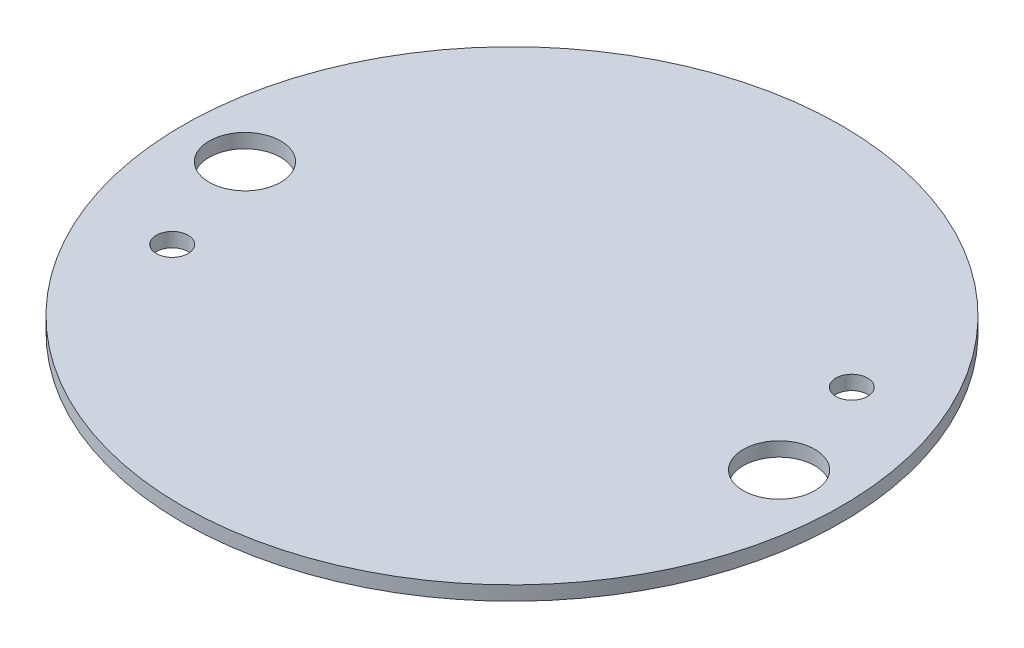
ISO-10303-21;
HEADER;
FILE_DESCRIPTION(('STEP AP214'),'2;1');
FILE_NAME('part.step','',(''),(''),'','','');
FILE_SCHEMA(('AUTOMOTIVE_DESIGN { 1 0 10303 214 1 1 1 1 }'));
ENDSEC;
DATA;
#1=APPLICATION_CONTEXT('core data for automotive mechanical design processes');
#2=APPLICATION_PROTOCOL_DEFINITION('international standard','automotive_design',2000,#1);
#3=PRODUCT_CONTEXT('',#1,'mechanical');
#4=PRODUCT('Part','Part','',(#3));
#5=PRODUCT_RELATED_PRODUCT_CATEGORY('part','',(#4));
#6=PRODUCT_DEFINITION_FORMATION('','',#4);
#7=PRODUCT_DEFINITION_CONTEXT('part definition',#1,'design');
#8=PRODUCT_DEFINITION('design','',#6,#7);
#9=PRODUCT_DEFINITION_SHAPE('','',#8);
#10=(LENGTH_UNIT() NAMED_UNIT(*) SI_UNIT(.MILLI.,.METRE.));
#11=(NAMED_UNIT(*) PLANE_ANGLE_UNIT() SI_UNIT($,.RADIAN.));
#12=(NAMED_UNIT(*) SI_UNIT($,.STERADIAN.) SOLID_ANGLE_UNIT());
#13=UNCERTAINTY_MEASURE_WITH_UNIT(LENGTH_MEASURE(1.E-05),#10,'distance_accuracy_value','');
#14=(GEOMETRIC_REPRESENTATION_CONTEXT(3) GLOBAL_UNCERTAINTY_ASSIGNED_CONTEXT((#13)) GLOBAL_UNIT_ASSIGNED_CONTEXT((#10,
#11,#12)) REPRESENTATION_CONTEXT('',''));
#15=CARTESIAN_POINT('',(0.,0.,0.));
#16=DIRECTION('',(0.,0.,1.));
#17=DIRECTION('',(1.,0.,0.));
#18=AXIS2_PLACEMENT_3D('',#15,#16,#17);
#19=CARTESIAN_POINT('',(0.,3.175,0.));
#20=DIRECTION('',(0.,-1.,0.));
#21=DIRECTION('',(0.,0.,-1.));
#22=AXIS2_PLACEMENT_3D('',#19,#20,#21);
#23=CYLINDRICAL_SURFACE('',#22,73.66);
#24=CARTESIAN_POINT('',(0.,3.175,0.));
#25=DIRECTION('',(0.,1.,0.));
#26=DIRECTION('',(0.,0.,1.));
#27=AXIS2_PLACEMENT_3D('',#24,#25,#26);
#28=CIRCLE('',#27,73.66);
#29=CARTESIAN_POINT('',(0.,3.175,73.66));
#30=VERTEX_POINT('',#29);
#31=EDGE_CURVE('E10',#30,#30,#28,.T.);
#32=ORIENTED_EDGE('',*,*,#31,.F.);
#33=EDGE_LOOP('',(#32));
#34=FACE_BOUND('',#33,.T.);
#35=CARTESIAN_POINT('',(0.,0.,0.));
#36=DIRECTION('',(0.,1.,0.));
#37=DIRECTION('',(0.,0.,1.));
#38=AXIS2_PLACEMENT_3D('',#35,#36,#37);
#39=CIRCLE('',#38,73.66);
#40=CARTESIAN_POINT('',(0.,0.,73.66));
#41=VERTEX_POINT('',#40);
#42=EDGE_CURVE('E40',#41,#41,#39,.T.);
#43=ORIENTED_EDGE('',*,*,#42,.T.);
#44=EDGE_LOOP('',(#43));
#45=FACE_BOUND('',#44,.T.);
#46=ADVANCED_FACE('F37',(#34,#45),#23,.T.);
#47=CARTESIAN_POINT('',(0.,3.175,0.));
#48=DIRECTION('',(0.,1.,0.));
#49=DIRECTION('',(0.,0.,1.));
#50=AXIS2_PLACEMENT_3D('',#47,#48,#49);
#51=PLANE('',#50);
#52=CARTESIAN_POINT('',(51.7954900291445,3.175,-24.1526336584811));
#53=DIRECTION('',(0.,1.,0.));
#54=DIRECTION('',(0.,0.,1.));
#55=AXIS2_PLACEMENT_3D('',#52,#53,#54);
#56=CIRCLE('',#55,3.55600000000001);
#57=CARTESIAN_POINT('',(51.7954900291445,3.175,-20.5966336584811));
#58=VERTEX_POINT('',#57);
#59=EDGE_CURVE('E58',#58,#58,#56,.T.);
#60=ORIENTED_EDGE('',*,*,#59,.F.);
#61=EDGE_LOOP('',(#60));
#62=FACE_BOUND('',#61,.T.);
#63=CARTESIAN_POINT('',(-51.7954900291445,3.175,24.1526336584811));
#64=DIRECTION('',(0.,1.,0.));
#65=DIRECTION('',(0.,0.,1.));
#66=AXIS2_PLACEMENT_3D('',#63,#64,#65);
#67=CIRCLE('',#66,3.55600000000001);
#68=CARTESIAN_POINT('',(-51.7954900291445,3.175,27.7086336584811));
#69=VERTEX_POINT('',#68);
#70=EDGE_CURVE('E64',#69,#69,#67,.T.);
#71=ORIENTED_EDGE('',*,*,#70,.F.);
#72=EDGE_LOOP('',(#71));
#73=FACE_BOUND('',#72,.T.);
#74=CARTESIAN_POINT('',(59.69,3.175,0.));
#75=DIRECTION('',(0.,1.,0.));
#76=DIRECTION('',(0.,0.,1.));
#77=AXIS2_PLACEMENT_3D('',#74,#75,#76);
#78=CIRCLE('',#77,8.00099999999998);
#79=CARTESIAN_POINT('',(59.69,3.175,8.00099999999996));
#80=VERTEX_POINT('',#79);
#81=EDGE_CURVE('E52',#80,#80,#78,.T.);
#82=ORIENTED_EDGE('',*,*,#81,.F.);
#83=EDGE_LOOP('',(#82));
#84=FACE_BOUND('',#83,.T.);
#85=CARTESIAN_POINT('',(-59.69,3.175,0.));
#86=DIRECTION('',(0.,1.,0.));
#87=DIRECTION('',(0.,0.,1.));
#88=AXIS2_PLACEMENT_3D('',#85,#86,#87);
#89=CIRCLE('',#88,8.001);
#90=CARTESIAN_POINT('',(-59.69,3.175,8.00100000000002));
#91=VERTEX_POINT('',#90);
#92=EDGE_CURVE('E49',#91,#91,#89,.T.);
#93=ORIENTED_EDGE('',*,*,#92,.F.);
#94=EDGE_LOOP('',(#93));
#95=FACE_BOUND('',#94,.T.);
#96=ORIENTED_EDGE('',*,*,#31,.T.);
#97=EDGE_LOOP('',(#96));
#98=FACE_BOUND('',#97,.T.);
#99=ADVANCED_FACE('F75',(#62,#73,#84,#95,#98),#51,.T.);
#100=CARTESIAN_POINT('',(0.,0.,0.));
#101=DIRECTION('',(0.,1.,0.));
#102=DIRECTION('',(0.,0.,1.));
#103=AXIS2_PLACEMENT_3D('',#100,#101,#102);
#104=PLANE('',#103);
#105=CARTESIAN_POINT('',(51.7954900291445,0.,-24.1526336584811));
#106=DIRECTION('',(0.,1.,0.));
#107=DIRECTION('',(0.,0.,1.));
#108=AXIS2_PLACEMENT_3D('',#105,#106,#107);
#109=CIRCLE('',#108,3.55600000000001);
#110=CARTESIAN_POINT('',(51.7954900291445,0.,-20.5966336584811));
#111=VERTEX_POINT('',#110);
#112=EDGE_CURVE('E55',#111,#111,#109,.T.);
#113=ORIENTED_EDGE('',*,*,#112,.T.);
#114=EDGE_LOOP('',(#113));
#115=FACE_BOUND('',#114,.T.);
#116=CARTESIAN_POINT('',(-51.7954900291445,0.,24.1526336584811));
#117=DIRECTION('',(0.,1.,0.));
#118=DIRECTION('',(0.,0.,1.));
#119=AXIS2_PLACEMENT_3D('',#116,#117,#118);
#120=CIRCLE('',#119,3.55600000000001);
#121=CARTESIAN_POINT('',(-51.7954900291445,0.,27.7086336584811));
#122=VERTEX_POINT('',#121);
#123=EDGE_CURVE('E61',#122,#122,#120,.T.);
#124=ORIENTED_EDGE('',*,*,#123,.T.);
#125=EDGE_LOOP('',(#124));
#126=FACE_BOUND('',#125,.T.);
#127=CARTESIAN_POINT('',(59.69,0.,0.));
#128=DIRECTION('',(0.,1.,0.));
#129=DIRECTION('',(0.,0.,1.));
#130=AXIS2_PLACEMENT_3D('',#127,#128,#129);
#131=CIRCLE('',#130,8.00099999999998);
#132=CARTESIAN_POINT('',(59.69,0.,8.00099999999996));
#133=VERTEX_POINT('',#132);
#134=EDGE_CURVE('E67',#133,#133,#131,.T.);
#135=ORIENTED_EDGE('',*,*,#134,.T.);
#136=EDGE_LOOP('',(#135));
#137=FACE_BOUND('',#136,.T.);
#138=CARTESIAN_POINT('',(-59.69,0.,0.));
#139=DIRECTION('',(0.,1.,0.));
#140=DIRECTION('',(0.,0.,1.));
#141=AXIS2_PLACEMENT_3D('',#138,#139,#140);
#142=CIRCLE('',#141,8.001);
#143=CARTESIAN_POINT('',(-59.69,0.,8.00100000000002));
#144=VERTEX_POINT('',#143);
#145=EDGE_CURVE('E47',#144,#144,#142,.T.);
#146=ORIENTED_EDGE('',*,*,#145,.T.);
#147=EDGE_LOOP('',(#146));
#148=FACE_BOUND('',#147,.T.);
#149=ORIENTED_EDGE('',*,*,#42,.F.);
#150=EDGE_LOOP('',(#149));
#151=FACE_BOUND('',#150,.T.);
#152=ADVANCED_FACE('F78',(#115,#126,#137,#148,#151),#104,.F.);
#153=CARTESIAN_POINT('',(-59.69,0.,0.));
#154=DIRECTION('',(0.,1.,0.));
#155=DIRECTION('',(0.,0.,1.));
#156=AXIS2_PLACEMENT_3D('',#153,#154,#155);
#157=CYLINDRICAL_SURFACE('',#156,8.001);
#158=ORIENTED_EDGE('',*,*,#145,.F.);
#159=EDGE_LOOP('',(#158));
#160=FACE_BOUND('',#159,.T.);
#161=ORIENTED_EDGE('',*,*,#92,.T.);
#162=EDGE_LOOP('',(#161));
#163=FACE_BOUND('',#162,.T.);
#164=ADVANCED_FACE('F83',(#160,#163),#157,.F.);
#165=CARTESIAN_POINT('',(59.69,0.,0.));
#166=DIRECTION('',(0.,1.,0.));
#167=DIRECTION('',(0.,0.,1.));
#168=AXIS2_PLACEMENT_3D('',#165,#166,#167);
#169=CYLINDRICAL_SURFACE('',#168,8.00099999999998);
#170=ORIENTED_EDGE('',*,*,#134,.F.);
#171=EDGE_LOOP('',(#170));
#172=FACE_BOUND('',#171,.T.);
#173=ORIENTED_EDGE('',*,*,#81,.T.);
#174=EDGE_LOOP('',(#173));
#175=FACE_BOUND('',#174,.T.);
#176=ADVANCED_FACE('F73',(#172,#175),#169,.F.);
#177=CARTESIAN_POINT('',(-51.7954900291445,0.,24.1526336584811));
#178=DIRECTION('',(0.,1.,0.));
#179=DIRECTION('',(0.,0.,1.));
#180=AXIS2_PLACEMENT_3D('',#177,#178,#179);
#181=CYLINDRICAL_SURFACE('',#180,3.55600000000001);
#182=ORIENTED_EDGE('',*,*,#123,.F.);
#183=EDGE_LOOP('',(#182));
#184=FACE_BOUND('',#183,.T.);
#185=ORIENTED_EDGE('',*,*,#70,.T.);
#186=EDGE_LOOP('',(#185));
#187=FACE_BOUND('',#186,.T.);
#188=ADVANCED_FACE('F91',(#184,#187),#181,.F.);
#189=CARTESIAN_POINT('',(51.7954900291445,0.,-24.1526336584811));
#190=DIRECTION('',(0.,1.,0.));
#191=DIRECTION('',(0.,0.,1.));
#192=AXIS2_PLACEMENT_3D('',#189,#190,#191);
#193=CYLINDRICAL_SURFACE('',#192,3.55600000000001);
#194=ORIENTED_EDGE('',*,*,#112,.F.);
#195=EDGE_LOOP('',(#194));
#196=FACE_BOUND('',#195,.T.);
#197=ORIENTED_EDGE('',*,*,#59,.T.);
#198=EDGE_LOOP('',(#197));
#199=FACE_BOUND('',#198,.T.);
#200=ADVANCED_FACE('F134',(#196,#199),#193,.F.);
#201=CLOSED_SHELL('',(#46,#99,#152,#164,#176,#188,#200));
#202=MANIFOLD_SOLID_BREP('B2',#201);
#203=ADVANCED_BREP_SHAPE_REPRESENTATION('',(#18,#202),#14);
#204=SHAPE_DEFINITION_REPRESENTATION(#9,#203);
ENDSEC;
END-ISO-10303-21;
